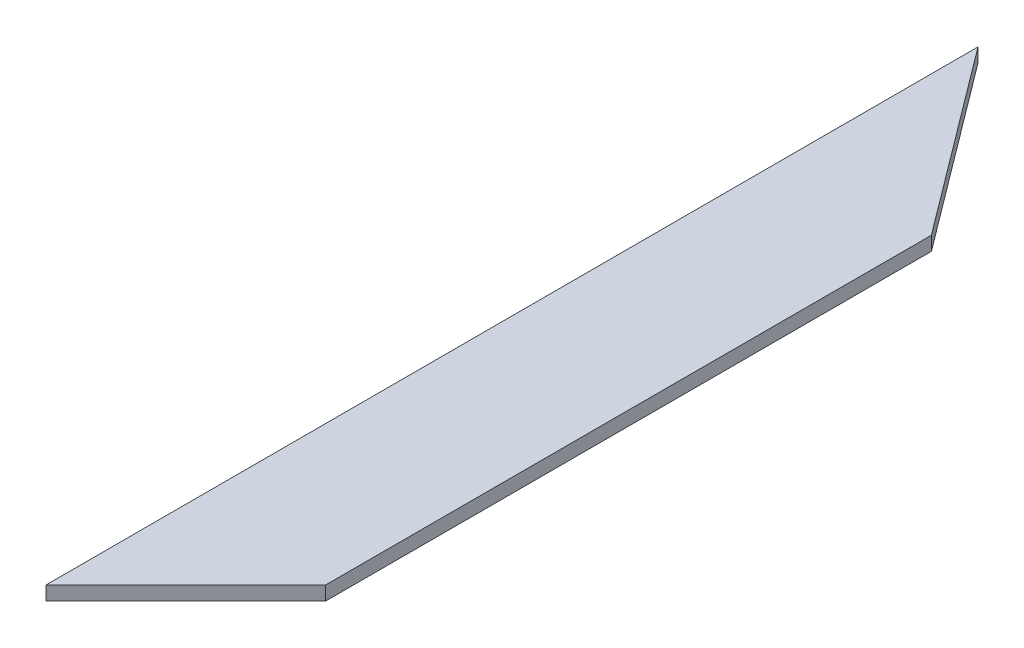
ISO-10303-21;
HEADER;
FILE_DESCRIPTION(('STEP AP214'),'2;1');
FILE_NAME('part.step','',(''),(''),'','','');
FILE_SCHEMA(('AUTOMOTIVE_DESIGN { 1 0 10303 214 1 1 1 1 }'));
ENDSEC;
DATA;
#1=APPLICATION_CONTEXT('core data for automotive mechanical design processes');
#2=APPLICATION_PROTOCOL_DEFINITION('international standard','automotive_design',2000,#1);
#3=PRODUCT_CONTEXT('',#1,'mechanical');
#4=PRODUCT('Part','Part','',(#3));
#5=PRODUCT_RELATED_PRODUCT_CATEGORY('part','',(#4));
#6=PRODUCT_DEFINITION_FORMATION('','',#4);
#7=PRODUCT_DEFINITION_CONTEXT('part definition',#1,'design');
#8=PRODUCT_DEFINITION('design','',#6,#7);
#9=PRODUCT_DEFINITION_SHAPE('','',#8);
#10=(LENGTH_UNIT() NAMED_UNIT(*) SI_UNIT(.MILLI.,.METRE.));
#11=(NAMED_UNIT(*) PLANE_ANGLE_UNIT() SI_UNIT($,.RADIAN.));
#12=(NAMED_UNIT(*) SI_UNIT($,.STERADIAN.) SOLID_ANGLE_UNIT());
#13=UNCERTAINTY_MEASURE_WITH_UNIT(LENGTH_MEASURE(1.E-05),#10,'distance_accuracy_value','');
#14=(GEOMETRIC_REPRESENTATION_CONTEXT(3) GLOBAL_UNCERTAINTY_ASSIGNED_CONTEXT((#13)) GLOBAL_UNIT_ASSIGNED_CONTEXT((#10,
#11,#12)) REPRESENTATION_CONTEXT('',''));
#15=CARTESIAN_POINT('',(0.,0.,0.));
#16=DIRECTION('',(0.,0.,1.));
#17=DIRECTION('',(1.,0.,0.));
#18=AXIS2_PLACEMENT_3D('',#15,#16,#17);
#19=CARTESIAN_POINT('',(30.,3.,-30.));
#20=DIRECTION('',(-0.707106781186547,0.,-0.707106781186548));
#21=DIRECTION('',(-0.707106781186548,0.,0.707106781186547));
#22=AXIS2_PLACEMENT_3D('',#19,#20,#21);
#23=PLANE('',#22);
#24=DIRECTION('',(0.707106781186548,0.,-0.707106781186547));
#25=VECTOR('',#24,1.);
#26=CARTESIAN_POINT('',(30.,0.,-30.));
#27=LINE('',#26,#25);
#28=CARTESIAN_POINT('',(0.,0.,0.));
#29=VERTEX_POINT('',#28);
#30=CARTESIAN_POINT('',(30.,0.,-30.));
#31=VERTEX_POINT('',#30);
#32=EDGE_CURVE('E98',#29,#31,#27,.T.);
#33=ORIENTED_EDGE('',*,*,#32,.T.);
#34=DIRECTION('',(0.,-1.,0.));
#35=VECTOR('',#34,1.);
#36=CARTESIAN_POINT('',(30.,3.,-30.));
#37=LINE('',#36,#35);
#38=CARTESIAN_POINT('',(30.,3.,-30.));
#39=VERTEX_POINT('',#38);
#40=EDGE_CURVE('E11',#39,#31,#37,.T.);
#41=ORIENTED_EDGE('',*,*,#40,.F.);
#42=DIRECTION('',(0.707106781186548,0.,-0.707106781186547));
#43=VECTOR('',#42,1.);
#44=CARTESIAN_POINT('',(30.,3.,-30.));
#45=LINE('',#44,#43);
#46=CARTESIAN_POINT('',(0.,3.,0.));
#47=VERTEX_POINT('',#46);
#48=EDGE_CURVE('E86',#47,#39,#45,.T.);
#49=ORIENTED_EDGE('',*,*,#48,.F.);
#50=DIRECTION('',(0.,-1.,0.));
#51=VECTOR('',#50,1.);
#52=CARTESIAN_POINT('',(0.,3.,0.));
#53=LINE('',#52,#51);
#54=EDGE_CURVE('E94',#47,#29,#53,.T.);
#55=ORIENTED_EDGE('',*,*,#54,.T.);
#56=EDGE_LOOP('',(#33,#41,#49,#55));
#57=FACE_BOUND('',#56,.T.);
#58=ADVANCED_FACE('F35',(#57),#23,.F.);
#59=CARTESIAN_POINT('',(30.,3.,-160.));
#60=DIRECTION('',(-1.,0.,0.));
#61=DIRECTION('',(0.,0.,1.));
#62=AXIS2_PLACEMENT_3D('',#59,#60,#61);
#63=PLANE('',#62);
#64=DIRECTION('',(0.,0.,-1.));
#65=VECTOR('',#64,1.);
#66=CARTESIAN_POINT('',(30.,0.,-160.));
#67=LINE('',#66,#65);
#68=CARTESIAN_POINT('',(30.,0.,-160.));
#69=VERTEX_POINT('',#68);
#70=EDGE_CURVE('E90',#31,#69,#67,.T.);
#71=ORIENTED_EDGE('',*,*,#70,.T.);
#72=DIRECTION('',(0.,-1.,0.));
#73=VECTOR('',#72,1.);
#74=CARTESIAN_POINT('',(30.,3.,-160.));
#75=LINE('',#74,#73);
#76=CARTESIAN_POINT('',(30.,3.,-160.));
#77=VERTEX_POINT('',#76);
#78=EDGE_CURVE('E43',#77,#69,#75,.T.);
#79=ORIENTED_EDGE('',*,*,#78,.F.);
#80=DIRECTION('',(0.,0.,-1.));
#81=VECTOR('',#80,1.);
#82=CARTESIAN_POINT('',(30.,3.,-160.));
#83=LINE('',#82,#81);
#84=EDGE_CURVE('E81',#39,#77,#83,.T.);
#85=ORIENTED_EDGE('',*,*,#84,.F.);
#86=ORIENTED_EDGE('',*,*,#40,.T.);
#87=EDGE_LOOP('',(#71,#79,#85,#86));
#88=FACE_BOUND('',#87,.T.);
#89=ADVANCED_FACE('F89',(#88),#63,.F.);
#90=CARTESIAN_POINT('',(0.,3.,-200.));
#91=DIRECTION('',(-0.8,0.,0.6));
#92=DIRECTION('',(0.6,0.,0.8));
#93=AXIS2_PLACEMENT_3D('',#90,#91,#92);
#94=PLANE('',#93);
#95=DIRECTION('',(-0.6,0.,-0.8));
#96=VECTOR('',#95,1.);
#97=CARTESIAN_POINT('',(0.,0.,-200.));
#98=LINE('',#97,#96);
#99=CARTESIAN_POINT('',(0.,0.,-200.));
#100=VERTEX_POINT('',#99);
#101=EDGE_CURVE('E68',#69,#100,#98,.T.);
#102=ORIENTED_EDGE('',*,*,#101,.T.);
#103=DIRECTION('',(0.,-1.,0.));
#104=VECTOR('',#103,1.);
#105=CARTESIAN_POINT('',(0.,3.,-200.));
#106=LINE('',#105,#104);
#107=CARTESIAN_POINT('',(0.,3.,-200.));
#108=VERTEX_POINT('',#107);
#109=EDGE_CURVE('E91',#108,#100,#106,.T.);
#110=ORIENTED_EDGE('',*,*,#109,.F.);
#111=DIRECTION('',(-0.6,0.,-0.8));
#112=VECTOR('',#111,1.);
#113=CARTESIAN_POINT('',(0.,3.,-200.));
#114=LINE('',#113,#112);
#115=EDGE_CURVE('E84',#77,#108,#114,.T.);
#116=ORIENTED_EDGE('',*,*,#115,.F.);
#117=ORIENTED_EDGE('',*,*,#78,.T.);
#118=EDGE_LOOP('',(#102,#110,#116,#117));
#119=FACE_BOUND('',#118,.T.);
#120=ADVANCED_FACE('F92',(#119),#94,.F.);
#121=CARTESIAN_POINT('',(0.,3.,0.));
#122=DIRECTION('',(1.,0.,0.));
#123=DIRECTION('',(0.,0.,-1.));
#124=AXIS2_PLACEMENT_3D('',#121,#122,#123);
#125=PLANE('',#124);
#126=DIRECTION('',(0.,0.,1.));
#127=VECTOR('',#126,1.);
#128=CARTESIAN_POINT('',(0.,0.,0.));
#129=LINE('',#128,#127);
#130=EDGE_CURVE('E74',#100,#29,#129,.T.);
#131=ORIENTED_EDGE('',*,*,#130,.T.);
#132=ORIENTED_EDGE('',*,*,#54,.F.);
#133=DIRECTION('',(0.,0.,1.));
#134=VECTOR('',#133,1.);
#135=CARTESIAN_POINT('',(0.,3.,0.));
#136=LINE('',#135,#134);
#137=EDGE_CURVE('E51',#108,#47,#136,.T.);
#138=ORIENTED_EDGE('',*,*,#137,.F.);
#139=ORIENTED_EDGE('',*,*,#109,.T.);
#140=EDGE_LOOP('',(#131,#132,#138,#139));
#141=FACE_BOUND('',#140,.T.);
#142=ADVANCED_FACE('F105',(#141),#125,.F.);
#143=CARTESIAN_POINT('',(0.,3.,0.));
#144=DIRECTION('',(0.,1.,0.));
#145=DIRECTION('',(0.,0.,1.));
#146=AXIS2_PLACEMENT_3D('',#143,#144,#145);
#147=PLANE('',#146);
#148=ORIENTED_EDGE('',*,*,#48,.T.);
#149=ORIENTED_EDGE('',*,*,#84,.T.);
#150=ORIENTED_EDGE('',*,*,#115,.T.);
#151=ORIENTED_EDGE('',*,*,#137,.T.);
#152=EDGE_LOOP('',(#148,#149,#150,#151));
#153=FACE_BOUND('',#152,.T.);
#154=ADVANCED_FACE('F82',(#153),#147,.T.);
#155=CARTESIAN_POINT('',(0.,0.,0.));
#156=DIRECTION('',(0.,1.,0.));
#157=DIRECTION('',(0.,0.,1.));
#158=AXIS2_PLACEMENT_3D('',#155,#156,#157);
#159=PLANE('',#158);
#160=ORIENTED_EDGE('',*,*,#32,.F.);
#161=ORIENTED_EDGE('',*,*,#130,.F.);
#162=ORIENTED_EDGE('',*,*,#101,.F.);
#163=ORIENTED_EDGE('',*,*,#70,.F.);
#164=EDGE_LOOP('',(#160,#161,#162,#163));
#165=FACE_BOUND('',#164,.T.);
#166=ADVANCED_FACE('F108',(#165),#159,.F.);
#167=CLOSED_SHELL('',(#58,#89,#120,#142,#154,#166));
#168=MANIFOLD_SOLID_BREP('B2',#167);
#169=ADVANCED_BREP_SHAPE_REPRESENTATION('',(#18,#168),#14);
#170=SHAPE_DEFINITION_REPRESENTATION(#9,#169);
ENDSEC;
END-ISO-10303-21;
